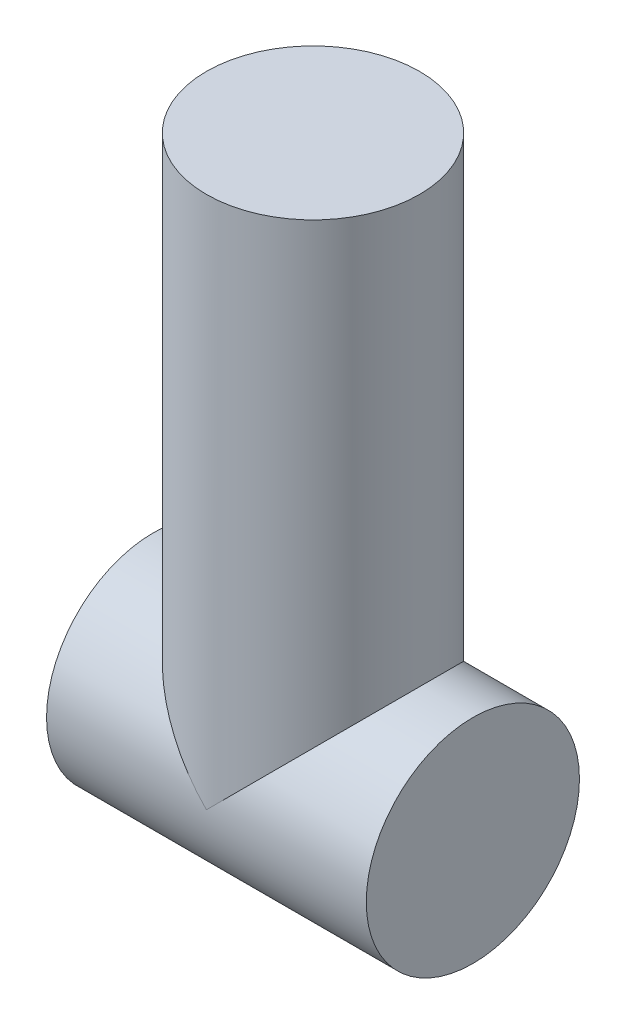
ISO-10303-21;
HEADER;
FILE_DESCRIPTION(('STEP AP214'),'2;1');
FILE_NAME('part.step','',(''),(''),'','','');
FILE_SCHEMA(('AUTOMOTIVE_DESIGN { 1 0 10303 214 1 1 1 1 }'));
ENDSEC;
DATA;
#1=APPLICATION_CONTEXT('core data for automotive mechanical design processes');
#2=APPLICATION_PROTOCOL_DEFINITION('international standard','automotive_design',2000,#1);
#3=PRODUCT_CONTEXT('',#1,'mechanical');
#4=PRODUCT('Part','Part','',(#3));
#5=PRODUCT_RELATED_PRODUCT_CATEGORY('part','',(#4));
#6=PRODUCT_DEFINITION_FORMATION('','',#4);
#7=PRODUCT_DEFINITION_CONTEXT('part definition',#1,'design');
#8=PRODUCT_DEFINITION('design','',#6,#7);
#9=PRODUCT_DEFINITION_SHAPE('','',#8);
#10=(LENGTH_UNIT() NAMED_UNIT(*) SI_UNIT(.MILLI.,.METRE.));
#11=(NAMED_UNIT(*) PLANE_ANGLE_UNIT() SI_UNIT($,.RADIAN.));
#12=(NAMED_UNIT(*) SI_UNIT($,.STERADIAN.) SOLID_ANGLE_UNIT());
#13=UNCERTAINTY_MEASURE_WITH_UNIT(LENGTH_MEASURE(1.E-05),#10,'distance_accuracy_value','');
#14=(GEOMETRIC_REPRESENTATION_CONTEXT(3) GLOBAL_UNCERTAINTY_ASSIGNED_CONTEXT((#13)) GLOBAL_UNIT_ASSIGNED_CONTEXT((#10,
#11,#12)) REPRESENTATION_CONTEXT('',''));
#15=CARTESIAN_POINT('',(0.,0.,0.));
#16=DIRECTION('',(0.,0.,1.));
#17=DIRECTION('',(1.,0.,0.));
#18=AXIS2_PLACEMENT_3D('',#15,#16,#17);
#19=CARTESIAN_POINT('',(0.,100.,0.));
#20=DIRECTION('',(0.,-1.,0.));
#21=DIRECTION('',(0.,0.,-1.));
#22=AXIS2_PLACEMENT_3D('',#19,#20,#21);
#23=CYLINDRICAL_SURFACE('',#22,20.);
#24=CARTESIAN_POINT('',(0.,100.,0.));
#25=DIRECTION('',(0.,1.,0.));
#26=DIRECTION('',(0.,0.,1.));
#27=AXIS2_PLACEMENT_3D('',#24,#25,#26);
#28=CIRCLE('',#27,20.);
#29=CARTESIAN_POINT('',(0.,100.,20.));
#30=VERTEX_POINT('',#29);
#31=EDGE_CURVE('E11',#30,#30,#28,.T.);
#32=ORIENTED_EDGE('',*,*,#31,.F.);
#33=EDGE_LOOP('',(#32));
#34=FACE_BOUND('',#33,.T.);
#35=CARTESIAN_POINT('',(0.,0.,0.));
#36=DIRECTION('',(-0.707106781186547,-0.707106781186547,0.));
#37=DIRECTION('',(0.707106781186547,-0.707106781186547,0.));
#38=AXIS2_PLACEMENT_3D('',#35,#36,#37);
#39=ELLIPSE('',#38,28.2842712474619,20.);
#40=CARTESIAN_POINT('',(0.,0.,20.));
#41=VERTEX_POINT('',#40);
#42=CARTESIAN_POINT('',(0.,0.,-20.));
#43=VERTEX_POINT('',#42);
#44=EDGE_CURVE('E44',#41,#43,#39,.T.);
#45=ORIENTED_EDGE('',*,*,#44,.F.);
#46=CARTESIAN_POINT('',(0.,0.,0.));
#47=DIRECTION('',(0.707106781186547,-0.707106781186547,0.));
#48=DIRECTION('',(-0.707106781186547,-0.707106781186547,0.));
#49=AXIS2_PLACEMENT_3D('',#46,#47,#48);
#50=ELLIPSE('',#49,28.2842712474619,20.);
#51=EDGE_CURVE('E50',#43,#41,#50,.T.);
#52=ORIENTED_EDGE('',*,*,#51,.F.);
#53=EDGE_LOOP('',(#45,#52));
#54=FACE_BOUND('',#53,.T.);
#55=ADVANCED_FACE('F37',(#34,#54),#23,.T.);
#56=CARTESIAN_POINT('',(0.,100.,0.));
#57=DIRECTION('',(0.,1.,0.));
#58=DIRECTION('',(0.,0.,1.));
#59=AXIS2_PLACEMENT_3D('',#56,#57,#58);
#60=PLANE('',#59);
#61=ORIENTED_EDGE('',*,*,#31,.T.);
#62=EDGE_LOOP('',(#61));
#63=FACE_BOUND('',#62,.T.);
#64=ADVANCED_FACE('F75',(#63),#60,.T.);
#65=CARTESIAN_POINT('',(30.,0.,0.));
#66=DIRECTION('',(-1.,0.,0.));
#67=DIRECTION('',(0.,0.,1.));
#68=AXIS2_PLACEMENT_3D('',#65,#66,#67);
#69=CYLINDRICAL_SURFACE('',#68,20.);
#70=CARTESIAN_POINT('',(30.,0.,0.));
#71=DIRECTION('',(1.,0.,0.));
#72=DIRECTION('',(0.,0.,-1.));
#73=AXIS2_PLACEMENT_3D('',#70,#71,#72);
#74=CIRCLE('',#73,20.);
#75=CARTESIAN_POINT('',(30.,0.,-20.));
#76=VERTEX_POINT('',#75);
#77=EDGE_CURVE('E54',#76,#76,#74,.T.);
#78=ORIENTED_EDGE('',*,*,#77,.F.);
#79=EDGE_LOOP('',(#78));
#80=FACE_BOUND('',#79,.T.);
#81=CARTESIAN_POINT('',(-30.,0.,0.));
#82=DIRECTION('',(1.,0.,0.));
#83=DIRECTION('',(0.,0.,-1.));
#84=AXIS2_PLACEMENT_3D('',#81,#82,#83);
#85=CIRCLE('',#84,20.);
#86=CARTESIAN_POINT('',(-30.,0.,-20.));
#87=VERTEX_POINT('',#86);
#88=EDGE_CURVE('E57',#87,#87,#85,.T.);
#89=ORIENTED_EDGE('',*,*,#88,.T.);
#90=EDGE_LOOP('',(#89));
#91=FACE_BOUND('',#90,.T.);
#92=ORIENTED_EDGE('',*,*,#51,.T.);
#93=ORIENTED_EDGE('',*,*,#44,.T.);
#94=EDGE_LOOP('',(#92,#93));
#95=FACE_BOUND('',#94,.T.);
#96=ADVANCED_FACE('F53',(#80,#91,#95),#69,.T.);
#97=CARTESIAN_POINT('',(30.,0.,0.));
#98=DIRECTION('',(1.,0.,0.));
#99=DIRECTION('',(0.,0.,-1.));
#100=AXIS2_PLACEMENT_3D('',#97,#98,#99);
#101=PLANE('',#100);
#102=ORIENTED_EDGE('',*,*,#77,.T.);
#103=EDGE_LOOP('',(#102));
#104=FACE_BOUND('',#103,.T.);
#105=ADVANCED_FACE('F66',(#104),#101,.T.);
#106=CARTESIAN_POINT('',(-30.,0.,0.));
#107=DIRECTION('',(1.,0.,0.));
#108=DIRECTION('',(0.,0.,-1.));
#109=AXIS2_PLACEMENT_3D('',#106,#107,#108);
#110=PLANE('',#109);
#111=ORIENTED_EDGE('',*,*,#88,.F.);
#112=EDGE_LOOP('',(#111));
#113=FACE_BOUND('',#112,.T.);
#114=ADVANCED_FACE('F64',(#113),#110,.F.);
#115=CLOSED_SHELL('',(#55,#64,#96,#105,#114));
#116=MANIFOLD_SOLID_BREP('B2',#115);
#117=ADVANCED_BREP_SHAPE_REPRESENTATION('',(#18,#116),#14);
#118=SHAPE_DEFINITION_REPRESENTATION(#9,#117);
ENDSEC;
END-ISO-10303-21;
